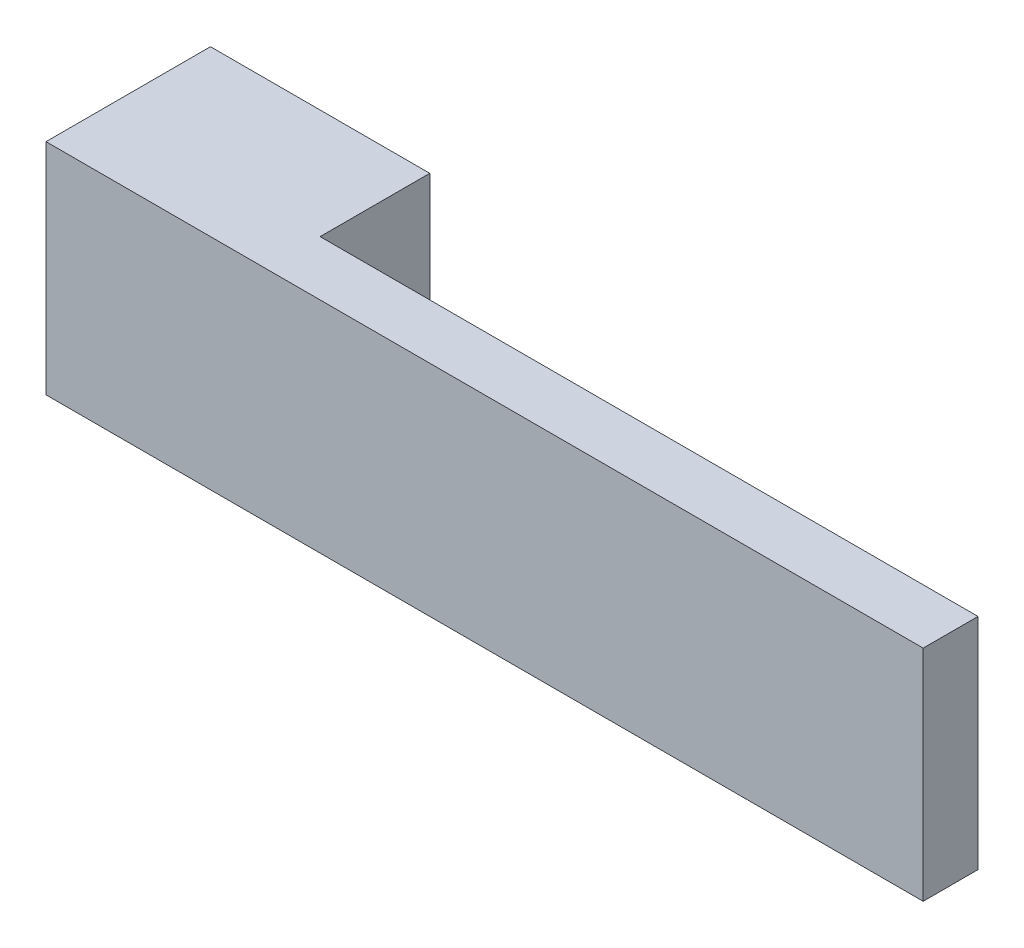
ISO-10303-21;
HEADER;
FILE_DESCRIPTION(('STEP AP214'),'2;1');
FILE_NAME('part.step','',(''),(''),'','','');
FILE_SCHEMA(('AUTOMOTIVE_DESIGN { 1 0 10303 214 1 1 1 1 }'));
ENDSEC;
DATA;
#1=APPLICATION_CONTEXT('core data for automotive mechanical design processes');
#2=APPLICATION_PROTOCOL_DEFINITION('international standard','automotive_design',2000,#1);
#3=PRODUCT_CONTEXT('',#1,'mechanical');
#4=PRODUCT('Part','Part','',(#3));
#5=PRODUCT_RELATED_PRODUCT_CATEGORY('part','',(#4));
#6=PRODUCT_DEFINITION_FORMATION('','',#4);
#7=PRODUCT_DEFINITION_CONTEXT('part definition',#1,'design');
#8=PRODUCT_DEFINITION('design','',#6,#7);
#9=PRODUCT_DEFINITION_SHAPE('','',#8);
#10=(LENGTH_UNIT() NAMED_UNIT(*) SI_UNIT(.MILLI.,.METRE.));
#11=(NAMED_UNIT(*) PLANE_ANGLE_UNIT() SI_UNIT($,.RADIAN.));
#12=(NAMED_UNIT(*) SI_UNIT($,.STERADIAN.) SOLID_ANGLE_UNIT());
#13=UNCERTAINTY_MEASURE_WITH_UNIT(LENGTH_MEASURE(1.E-05),#10,'distance_accuracy_value','');
#14=(GEOMETRIC_REPRESENTATION_CONTEXT(3) GLOBAL_UNCERTAINTY_ASSIGNED_CONTEXT((#13)) GLOBAL_UNIT_ASSIGNED_CONTEXT((#10,
#11,#12)) REPRESENTATION_CONTEXT('',''));
#15=CARTESIAN_POINT('',(0.,0.,0.));
#16=DIRECTION('',(0.,0.,1.));
#17=DIRECTION('',(1.,0.,0.));
#18=AXIS2_PLACEMENT_3D('',#15,#16,#17);
#19=CARTESIAN_POINT('',(80.,20.,15.));
#20=DIRECTION('',(-1.,0.,0.));
#21=DIRECTION('',(0.,0.,1.));
#22=AXIS2_PLACEMENT_3D('',#19,#20,#21);
#23=PLANE('',#22);
#24=DIRECTION('',(0.,0.,-1.));
#25=VECTOR('',#24,1.);
#26=CARTESIAN_POINT('',(80.,0.,15.));
#27=LINE('',#26,#25);
#28=CARTESIAN_POINT('',(80.,0.,15.));
#29=VERTEX_POINT('',#28);
#30=CARTESIAN_POINT('',(80.,0.,9.99999999999999));
#31=VERTEX_POINT('',#30);
#32=EDGE_CURVE('E128',#29,#31,#27,.T.);
#33=ORIENTED_EDGE('',*,*,#32,.T.);
#34=DIRECTION('',(0.,-1.,0.));
#35=VECTOR('',#34,1.);
#36=CARTESIAN_POINT('',(80.,20.,9.99999999999999));
#37=LINE('',#36,#35);
#38=CARTESIAN_POINT('',(80.,20.,9.99999999999999));
#39=VERTEX_POINT('',#38);
#40=EDGE_CURVE('E11',#39,#31,#37,.T.);
#41=ORIENTED_EDGE('',*,*,#40,.F.);
#42=DIRECTION('',(0.,0.,-1.));
#43=VECTOR('',#42,1.);
#44=CARTESIAN_POINT('',(80.,20.,15.));
#45=LINE('',#44,#43);
#46=CARTESIAN_POINT('',(80.,20.,15.));
#47=VERTEX_POINT('',#46);
#48=EDGE_CURVE('E144',#47,#39,#45,.T.);
#49=ORIENTED_EDGE('',*,*,#48,.F.);
#50=DIRECTION('',(0.,-1.,0.));
#51=VECTOR('',#50,1.);
#52=CARTESIAN_POINT('',(80.,20.,15.));
#53=LINE('',#52,#51);
#54=EDGE_CURVE('E124',#47,#29,#53,.T.);
#55=ORIENTED_EDGE('',*,*,#54,.T.);
#56=EDGE_LOOP('',(#33,#41,#49,#55));
#57=FACE_BOUND('',#56,.T.);
#58=ADVANCED_FACE('F39',(#57),#23,.F.);
#59=CARTESIAN_POINT('',(80.,20.,9.99999999999999));
#60=DIRECTION('',(0.,0.,1.));
#61=DIRECTION('',(1.,0.,0.));
#62=AXIS2_PLACEMENT_3D('',#59,#60,#61);
#63=PLANE('',#62);
#64=DIRECTION('',(-1.,0.,0.));
#65=VECTOR('',#64,1.);
#66=CARTESIAN_POINT('',(80.,0.,9.99999999999999));
#67=LINE('',#66,#65);
#68=CARTESIAN_POINT('',(20.,0.,10.));
#69=VERTEX_POINT('',#68);
#70=EDGE_CURVE('E132',#31,#69,#67,.T.);
#71=ORIENTED_EDGE('',*,*,#70,.T.);
#72=DIRECTION('',(0.,-1.,0.));
#73=VECTOR('',#72,1.);
#74=CARTESIAN_POINT('',(20.,20.,10.));
#75=LINE('',#74,#73);
#76=CARTESIAN_POINT('',(20.,20.,10.));
#77=VERTEX_POINT('',#76);
#78=EDGE_CURVE('E48',#77,#69,#75,.T.);
#79=ORIENTED_EDGE('',*,*,#78,.F.);
#80=DIRECTION('',(-1.,0.,0.));
#81=VECTOR('',#80,1.);
#82=CARTESIAN_POINT('',(80.,20.,9.99999999999999));
#83=LINE('',#82,#81);
#84=EDGE_CURVE('E93',#39,#77,#83,.T.);
#85=ORIENTED_EDGE('',*,*,#84,.F.);
#86=ORIENTED_EDGE('',*,*,#40,.T.);
#87=EDGE_LOOP('',(#71,#79,#85,#86));
#88=FACE_BOUND('',#87,.T.);
#89=ADVANCED_FACE('F172',(#88),#63,.F.);
#90=CARTESIAN_POINT('',(20.,20.,10.));
#91=DIRECTION('',(-1.,0.,0.));
#92=DIRECTION('',(0.,0.,1.));
#93=AXIS2_PLACEMENT_3D('',#90,#91,#92);
#94=PLANE('',#93);
#95=DIRECTION('',(0.,0.,-1.));
#96=VECTOR('',#95,1.);
#97=CARTESIAN_POINT('',(20.,0.,10.));
#98=LINE('',#97,#96);
#99=CARTESIAN_POINT('',(20.,0.,0.));
#100=VERTEX_POINT('',#99);
#101=EDGE_CURVE('E135',#69,#100,#98,.T.);
#102=ORIENTED_EDGE('',*,*,#101,.T.);
#103=DIRECTION('',(0.,-1.,0.));
#104=VECTOR('',#103,1.);
#105=CARTESIAN_POINT('',(20.,20.,0.));
#106=LINE('',#105,#104);
#107=CARTESIAN_POINT('',(20.,20.,0.));
#108=VERTEX_POINT('',#107);
#109=EDGE_CURVE('E117',#108,#100,#106,.T.);
#110=ORIENTED_EDGE('',*,*,#109,.F.);
#111=DIRECTION('',(0.,0.,-1.));
#112=VECTOR('',#111,1.);
#113=CARTESIAN_POINT('',(20.,20.,10.));
#114=LINE('',#113,#112);
#115=EDGE_CURVE('E106',#77,#108,#114,.T.);
#116=ORIENTED_EDGE('',*,*,#115,.F.);
#117=ORIENTED_EDGE('',*,*,#78,.T.);
#118=EDGE_LOOP('',(#102,#110,#116,#117));
#119=FACE_BOUND('',#118,.T.);
#120=ADVANCED_FACE('F154',(#119),#94,.F.);
#121=CARTESIAN_POINT('',(0.,20.,0.));
#122=DIRECTION('',(0.,0.,1.));
#123=DIRECTION('',(1.,0.,0.));
#124=AXIS2_PLACEMENT_3D('',#121,#122,#123);
#125=PLANE('',#124);
#126=DIRECTION('',(-1.,0.,0.));
#127=VECTOR('',#126,1.);
#128=CARTESIAN_POINT('',(0.,0.,0.));
#129=LINE('',#128,#127);
#130=CARTESIAN_POINT('',(0.,0.,0.));
#131=VERTEX_POINT('',#130);
#132=EDGE_CURVE('E115',#100,#131,#129,.T.);
#133=ORIENTED_EDGE('',*,*,#132,.T.);
#134=DIRECTION('',(0.,-1.,0.));
#135=VECTOR('',#134,1.);
#136=CARTESIAN_POINT('',(0.,20.,0.));
#137=LINE('',#136,#135);
#138=CARTESIAN_POINT('',(0.,20.,0.));
#139=VERTEX_POINT('',#138);
#140=EDGE_CURVE('E112',#139,#131,#137,.T.);
#141=ORIENTED_EDGE('',*,*,#140,.F.);
#142=DIRECTION('',(-1.,0.,0.));
#143=VECTOR('',#142,1.);
#144=CARTESIAN_POINT('',(0.,20.,0.));
#145=LINE('',#144,#143);
#146=EDGE_CURVE('E100',#108,#139,#145,.T.);
#147=ORIENTED_EDGE('',*,*,#146,.F.);
#148=ORIENTED_EDGE('',*,*,#109,.T.);
#149=EDGE_LOOP('',(#133,#141,#147,#148));
#150=FACE_BOUND('',#149,.T.);
#151=ADVANCED_FACE('F113',(#150),#125,.F.);
#152=CARTESIAN_POINT('',(0.,20.,15.));
#153=DIRECTION('',(1.,0.,0.));
#154=DIRECTION('',(0.,0.,-1.));
#155=AXIS2_PLACEMENT_3D('',#152,#153,#154);
#156=PLANE('',#155);
#157=DIRECTION('',(0.,0.,1.));
#158=VECTOR('',#157,1.);
#159=CARTESIAN_POINT('',(0.,0.,15.));
#160=LINE('',#159,#158);
#161=CARTESIAN_POINT('',(0.,0.,15.));
#162=VERTEX_POINT('',#161);
#163=EDGE_CURVE('E79',#131,#162,#160,.T.);
#164=ORIENTED_EDGE('',*,*,#163,.T.);
#165=DIRECTION('',(0.,-1.,0.));
#166=VECTOR('',#165,1.);
#167=CARTESIAN_POINT('',(0.,20.,15.));
#168=LINE('',#167,#166);
#169=CARTESIAN_POINT('',(0.,20.,15.));
#170=VERTEX_POINT('',#169);
#171=EDGE_CURVE('E118',#170,#162,#168,.T.);
#172=ORIENTED_EDGE('',*,*,#171,.F.);
#173=DIRECTION('',(0.,0.,1.));
#174=VECTOR('',#173,1.);
#175=CARTESIAN_POINT('',(0.,20.,15.));
#176=LINE('',#175,#174);
#177=EDGE_CURVE('E104',#139,#170,#176,.T.);
#178=ORIENTED_EDGE('',*,*,#177,.F.);
#179=ORIENTED_EDGE('',*,*,#140,.T.);
#180=EDGE_LOOP('',(#164,#172,#178,#179));
#181=FACE_BOUND('',#180,.T.);
#182=ADVANCED_FACE('F120',(#181),#156,.F.);
#183=CARTESIAN_POINT('',(80.,20.,15.));
#184=DIRECTION('',(0.,0.,-1.));
#185=DIRECTION('',(-1.,0.,0.));
#186=AXIS2_PLACEMENT_3D('',#183,#184,#185);
#187=PLANE('',#186);
#188=DIRECTION('',(1.,0.,0.));
#189=VECTOR('',#188,1.);
#190=CARTESIAN_POINT('',(80.,0.,15.));
#191=LINE('',#190,#189);
#192=EDGE_CURVE('E85',#162,#29,#191,.T.);
#193=ORIENTED_EDGE('',*,*,#192,.T.);
#194=ORIENTED_EDGE('',*,*,#54,.F.);
#195=DIRECTION('',(1.,0.,0.));
#196=VECTOR('',#195,1.);
#197=CARTESIAN_POINT('',(80.,20.,15.));
#198=LINE('',#197,#196);
#199=EDGE_CURVE('E56',#170,#47,#198,.T.);
#200=ORIENTED_EDGE('',*,*,#199,.F.);
#201=ORIENTED_EDGE('',*,*,#171,.T.);
#202=EDGE_LOOP('',(#193,#194,#200,#201));
#203=FACE_BOUND('',#202,.T.);
#204=ADVANCED_FACE('F161',(#203),#187,.F.);
#205=CARTESIAN_POINT('',(0.,20.,0.));
#206=DIRECTION('',(0.,1.,0.));
#207=DIRECTION('',(0.,0.,1.));
#208=AXIS2_PLACEMENT_3D('',#205,#206,#207);
#209=PLANE('',#208);
#210=ORIENTED_EDGE('',*,*,#48,.T.);
#211=ORIENTED_EDGE('',*,*,#84,.T.);
#212=ORIENTED_EDGE('',*,*,#115,.T.);
#213=ORIENTED_EDGE('',*,*,#146,.T.);
#214=ORIENTED_EDGE('',*,*,#177,.T.);
#215=ORIENTED_EDGE('',*,*,#199,.T.);
#216=EDGE_LOOP('',(#210,#211,#212,#213,#214,#215));
#217=FACE_BOUND('',#216,.T.);
#218=ADVANCED_FACE('F102',(#217),#209,.T.);
#219=CARTESIAN_POINT('',(0.,0.,0.));
#220=DIRECTION('',(0.,1.,0.));
#221=DIRECTION('',(0.,0.,1.));
#222=AXIS2_PLACEMENT_3D('',#219,#220,#221);
#223=PLANE('',#222);
#224=ORIENTED_EDGE('',*,*,#32,.F.);
#225=ORIENTED_EDGE('',*,*,#192,.F.);
#226=ORIENTED_EDGE('',*,*,#163,.F.);
#227=ORIENTED_EDGE('',*,*,#132,.F.);
#228=ORIENTED_EDGE('',*,*,#101,.F.);
#229=ORIENTED_EDGE('',*,*,#70,.F.);
#230=EDGE_LOOP('',(#224,#225,#226,#227,#228,#229));
#231=FACE_BOUND('',#230,.T.);
#232=ADVANCED_FACE('F157',(#231),#223,.F.);
#233=CLOSED_SHELL('',(#58,#89,#120,#151,#182,#204,#218,#232));
#234=MANIFOLD_SOLID_BREP('B2',#233);
#235=ADVANCED_BREP_SHAPE_REPRESENTATION('',(#18,#234),#14);
#236=SHAPE_DEFINITION_REPRESENTATION(#9,#235);
ENDSEC;
END-ISO-10303-21;
